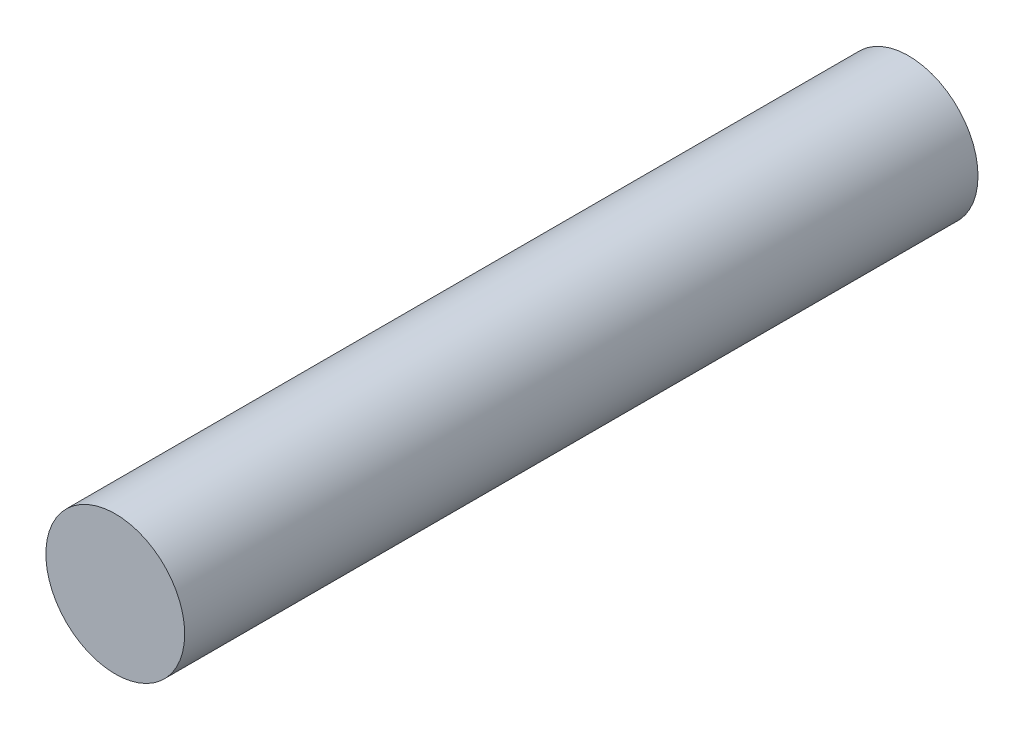
ISO-10303-21;
HEADER;
FILE_DESCRIPTION(('STEP AP214'),'2;1');
FILE_NAME('part.step','',(''),(''),'','','');
FILE_SCHEMA(('AUTOMOTIVE_DESIGN { 1 0 10303 214 1 1 1 1 }'));
ENDSEC;
DATA;
#1=APPLICATION_CONTEXT('core data for automotive mechanical design processes');
#2=APPLICATION_PROTOCOL_DEFINITION('international standard','automotive_design',2000,#1);
#3=PRODUCT_CONTEXT('',#1,'mechanical');
#4=PRODUCT('Part','Part','',(#3));
#5=PRODUCT_RELATED_PRODUCT_CATEGORY('part','',(#4));
#6=PRODUCT_DEFINITION_FORMATION('','',#4);
#7=PRODUCT_DEFINITION_CONTEXT('part definition',#1,'design');
#8=PRODUCT_DEFINITION('design','',#6,#7);
#9=PRODUCT_DEFINITION_SHAPE('','',#8);
#10=(LENGTH_UNIT() NAMED_UNIT(*) SI_UNIT(.MILLI.,.METRE.));
#11=(NAMED_UNIT(*) PLANE_ANGLE_UNIT() SI_UNIT($,.RADIAN.));
#12=(NAMED_UNIT(*) SI_UNIT($,.STERADIAN.) SOLID_ANGLE_UNIT());
#13=UNCERTAINTY_MEASURE_WITH_UNIT(LENGTH_MEASURE(1.E-05),#10,'distance_accuracy_value','');
#14=(GEOMETRIC_REPRESENTATION_CONTEXT(3) GLOBAL_UNCERTAINTY_ASSIGNED_CONTEXT((#13)) GLOBAL_UNIT_ASSIGNED_CONTEXT((#10,
#11,#12)) REPRESENTATION_CONTEXT('',''));
#15=CARTESIAN_POINT('',(0.,0.,0.));
#16=DIRECTION('',(0.,0.,1.));
#17=DIRECTION('',(1.,0.,0.));
#18=AXIS2_PLACEMENT_3D('',#15,#16,#17);
#19=CARTESIAN_POINT('',(0.,0.,400.));
#20=DIRECTION('',(0.,0.,-1.));
#21=DIRECTION('',(-1.,0.,0.));
#22=AXIS2_PLACEMENT_3D('',#19,#20,#21);
#23=CYLINDRICAL_SURFACE('',#22,35.);
#24=CARTESIAN_POINT('',(0.,0.,400.));
#25=DIRECTION('',(0.,0.,1.));
#26=DIRECTION('',(1.,0.,0.));
#27=AXIS2_PLACEMENT_3D('',#24,#25,#26);
#28=CIRCLE('',#27,35.);
#29=CARTESIAN_POINT('',(35.,0.,400.));
#30=VERTEX_POINT('',#29);
#31=EDGE_CURVE('E10',#30,#30,#28,.T.);
#32=ORIENTED_EDGE('',*,*,#31,.F.);
#33=EDGE_LOOP('',(#32));
#34=FACE_BOUND('',#33,.T.);
#35=CARTESIAN_POINT('',(0.,0.,0.));
#36=DIRECTION('',(0.,0.,1.));
#37=DIRECTION('',(1.,0.,0.));
#38=AXIS2_PLACEMENT_3D('',#35,#36,#37);
#39=CIRCLE('',#38,35.);
#40=CARTESIAN_POINT('',(35.,0.,0.));
#41=VERTEX_POINT('',#40);
#42=EDGE_CURVE('E38',#41,#41,#39,.T.);
#43=ORIENTED_EDGE('',*,*,#42,.T.);
#44=EDGE_LOOP('',(#43));
#45=FACE_BOUND('',#44,.T.);
#46=ADVANCED_FACE('F35',(#34,#45),#23,.T.);
#47=CARTESIAN_POINT('',(0.,0.,400.));
#48=DIRECTION('',(0.,0.,1.));
#49=DIRECTION('',(1.,0.,0.));
#50=AXIS2_PLACEMENT_3D('',#47,#48,#49);
#51=PLANE('',#50);
#52=ORIENTED_EDGE('',*,*,#31,.T.);
#53=EDGE_LOOP('',(#52));
#54=FACE_BOUND('',#53,.T.);
#55=ADVANCED_FACE('F50',(#54),#51,.T.);
#56=CARTESIAN_POINT('',(0.,0.,0.));
#57=DIRECTION('',(0.,0.,1.));
#58=DIRECTION('',(1.,0.,0.));
#59=AXIS2_PLACEMENT_3D('',#56,#57,#58);
#60=PLANE('',#59);
#61=ORIENTED_EDGE('',*,*,#42,.F.);
#62=EDGE_LOOP('',(#61));
#63=FACE_BOUND('',#62,.T.);
#64=ADVANCED_FACE('F48',(#63),#60,.F.);
#65=CLOSED_SHELL('',(#46,#55,#64));
#66=MANIFOLD_SOLID_BREP('B2',#65);
#67=ADVANCED_BREP_SHAPE_REPRESENTATION('',(#18,#66),#14);
#68=SHAPE_DEFINITION_REPRESENTATION(#9,#67);
ENDSEC;
END-ISO-10303-21;
